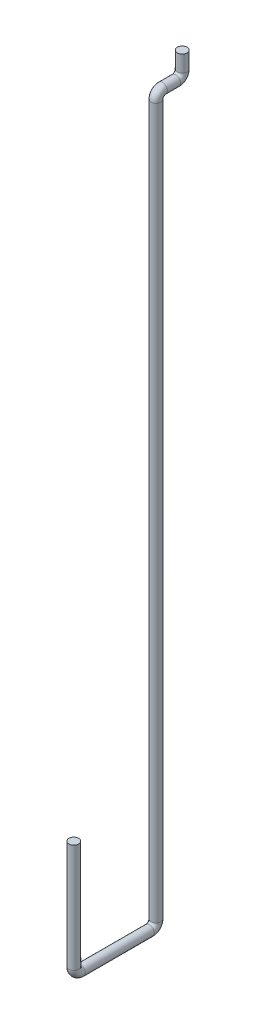
ISO-10303-21;
HEADER;
FILE_DESCRIPTION(('STEP AP214'),'2;1');
FILE_NAME('part.step','',(''),(''),'','','');
FILE_SCHEMA(('AUTOMOTIVE_DESIGN { 1 0 10303 214 1 1 1 1 }'));
ENDSEC;
DATA;
#1=APPLICATION_CONTEXT('core data for automotive mechanical design processes');
#2=APPLICATION_PROTOCOL_DEFINITION('international standard','automotive_design',2000,#1);
#3=PRODUCT_CONTEXT('',#1,'mechanical');
#4=PRODUCT('Part','Part','',(#3));
#5=PRODUCT_RELATED_PRODUCT_CATEGORY('part','',(#4));
#6=PRODUCT_DEFINITION_FORMATION('','',#4);
#7=PRODUCT_DEFINITION_CONTEXT('part definition',#1,'design');
#8=PRODUCT_DEFINITION('design','',#6,#7);
#9=PRODUCT_DEFINITION_SHAPE('','',#8);
#10=(LENGTH_UNIT() NAMED_UNIT(*) SI_UNIT(.MILLI.,.METRE.));
#11=(NAMED_UNIT(*) PLANE_ANGLE_UNIT() SI_UNIT($,.RADIAN.));
#12=(NAMED_UNIT(*) SI_UNIT($,.STERADIAN.) SOLID_ANGLE_UNIT());
#13=UNCERTAINTY_MEASURE_WITH_UNIT(LENGTH_MEASURE(1.E-05),#10,'distance_accuracy_value','');
#14=(GEOMETRIC_REPRESENTATION_CONTEXT(3) GLOBAL_UNCERTAINTY_ASSIGNED_CONTEXT((#13)) GLOBAL_UNIT_ASSIGNED_CONTEXT((#10,
#11,#12)) REPRESENTATION_CONTEXT('',''));
#15=CARTESIAN_POINT('',(0.,0.,0.));
#16=DIRECTION('',(0.,0.,1.));
#17=DIRECTION('',(1.,0.,0.));
#18=AXIS2_PLACEMENT_3D('',#15,#16,#17);
#19=CARTESIAN_POINT('',(0.,0.,0.));
#20=DIRECTION('',(0.,1.,0.));
#21=DIRECTION('',(0.,0.,1.));
#22=AXIS2_PLACEMENT_3D('',#19,#20,#21);
#23=PLANE('',#22);
#24=CARTESIAN_POINT('',(0.,0.,0.));
#25=DIRECTION('',(0.,1.,0.));
#26=DIRECTION('',(0.,0.,1.));
#27=AXIS2_PLACEMENT_3D('',#24,#25,#26);
#28=CIRCLE('',#27,1.5);
#29=CARTESIAN_POINT('',(0.,0.,1.5));
#30=VERTEX_POINT('',#29);
#31=EDGE_CURVE('E65',#30,#30,#28,.T.);
#32=ORIENTED_EDGE('',*,*,#31,.T.);
#33=EDGE_LOOP('',(#32));
#34=FACE_BOUND('',#33,.T.);
#35=ADVANCED_FACE('F31',(#34),#23,.T.);
#36=CARTESIAN_POINT('',(0.,-192.,32.9999999999999));
#37=DIRECTION('',(0.,-1.,0.));
#38=DIRECTION('',(0.,0.,-1.));
#39=AXIS2_PLACEMENT_3D('',#36,#37,#38);
#40=PLANE('',#39);
#41=CARTESIAN_POINT('',(0.,-192.,32.9999999999999));
#42=DIRECTION('',(0.,-1.,0.));
#43=DIRECTION('',(0.,0.,-1.));
#44=AXIS2_PLACEMENT_3D('',#41,#42,#43);
#45=CIRCLE('',#44,1.5);
#46=CARTESIAN_POINT('',(0.,-192.,31.4999999999999));
#47=VERTEX_POINT('',#46);
#48=EDGE_CURVE('E10',#47,#47,#45,.T.);
#49=ORIENTED_EDGE('',*,*,#48,.F.);
#50=EDGE_LOOP('',(#49));
#51=FACE_BOUND('',#50,.T.);
#52=ADVANCED_FACE('F73',(#51),#40,.F.);
#53=CARTESIAN_POINT('',(0.,0.,0.));
#54=DIRECTION('',(0.,-1.,0.));
#55=DIRECTION('',(0.,0.,-1.));
#56=AXIS2_PLACEMENT_3D('',#53,#54,#55);
#57=CYLINDRICAL_SURFACE('',#56,1.5);
#58=CARTESIAN_POINT('',(0.,-5.,0.));
#59=DIRECTION('',(0.,1.,0.));
#60=DIRECTION('',(0.,0.,1.));
#61=AXIS2_PLACEMENT_3D('',#58,#59,#60);
#62=CIRCLE('',#61,1.5);
#63=CARTESIAN_POINT('',(0.,-5.,-1.5));
#64=VERTEX_POINT('',#63);
#65=EDGE_CURVE('E62',#64,#64,#62,.T.);
#66=ORIENTED_EDGE('',*,*,#65,.T.);
#67=EDGE_LOOP('',(#66));
#68=FACE_BOUND('',#67,.T.);
#69=ORIENTED_EDGE('',*,*,#31,.F.);
#70=EDGE_LOOP('',(#69));
#71=FACE_BOUND('',#70,.T.);
#72=ADVANCED_FACE('F70',(#68,#71),#57,.T.);
#73=CARTESIAN_POINT('',(0.,-5.,2.));
#74=DIRECTION('',(-1.,0.,0.));
#75=DIRECTION('',(0.,0.,1.));
#76=AXIS2_PLACEMENT_3D('',#73,#74,#75);
#77=TOROIDAL_SURFACE('',#76,2.,1.5);
#78=CARTESIAN_POINT('',(0.,-7.,2.));
#79=DIRECTION('',(0.,0.,-1.));
#80=DIRECTION('',(0.,1.,0.));
#81=AXIS2_PLACEMENT_3D('',#78,#79,#80);
#82=CIRCLE('',#81,1.5);
#83=CARTESIAN_POINT('',(0.,-8.5,2.));
#84=VERTEX_POINT('',#83);
#85=EDGE_CURVE('E59',#84,#84,#82,.T.);
#86=CARTESIAN_POINT('',(0.,-5.,2.));
#87=DIRECTION('',(-1.,0.,0.));
#88=DIRECTION('',(0.,0.,1.));
#89=AXIS2_PLACEMENT_3D('',#86,#87,#88);
#90=CIRCLE('',#89,3.5);
#91=EDGE_CURVE('',#64,#84,#90,.T.);
#92=ORIENTED_EDGE('',*,*,#65,.F.);
#93=ORIENTED_EDGE('',*,*,#85,.T.);
#94=ORIENTED_EDGE('',*,*,#91,.T.);
#95=ORIENTED_EDGE('',*,*,#91,.F.);
#96=EDGE_LOOP('',(#92,#94,#93,#95));
#97=FACE_BOUND('',#96,.T.);
#98=ADVANCED_FACE('F72',(#97),#77,.T.);
#99=CARTESIAN_POINT('',(0.,-7.,2.));
#100=DIRECTION('',(0.,0.,1.));
#101=DIRECTION('',(0.,-1.,0.));
#102=AXIS2_PLACEMENT_3D('',#99,#100,#101);
#103=CYLINDRICAL_SURFACE('',#102,1.5);
#104=CARTESIAN_POINT('',(0.,-7.,6.));
#105=DIRECTION('',(0.,0.,-1.));
#106=DIRECTION('',(0.,1.,0.));
#107=AXIS2_PLACEMENT_3D('',#104,#105,#106);
#108=CIRCLE('',#107,1.5);
#109=CARTESIAN_POINT('',(0.,-5.5,6.));
#110=VERTEX_POINT('',#109);
#111=EDGE_CURVE('E56',#110,#110,#108,.T.);
#112=ORIENTED_EDGE('',*,*,#111,.T.);
#113=EDGE_LOOP('',(#112));
#114=FACE_BOUND('',#113,.T.);
#115=ORIENTED_EDGE('',*,*,#85,.F.);
#116=EDGE_LOOP('',(#115));
#117=FACE_BOUND('',#116,.T.);
#118=ADVANCED_FACE('F80',(#114,#117),#103,.T.);
#119=CARTESIAN_POINT('',(0.,-9.,6.));
#120=DIRECTION('',(1.,0.,0.));
#121=DIRECTION('',(0.,0.,-1.));
#122=AXIS2_PLACEMENT_3D('',#119,#120,#121);
#123=TOROIDAL_SURFACE('',#122,2.,1.5);
#124=CARTESIAN_POINT('',(0.,-9.,8.));
#125=DIRECTION('',(0.,1.,0.));
#126=DIRECTION('',(0.,0.,1.));
#127=AXIS2_PLACEMENT_3D('',#124,#125,#126);
#128=CIRCLE('',#127,1.5);
#129=CARTESIAN_POINT('',(0.,-9.,9.5));
#130=VERTEX_POINT('',#129);
#131=EDGE_CURVE('E53',#130,#130,#128,.T.);
#132=CARTESIAN_POINT('',(0.,-9.,6.));
#133=DIRECTION('',(1.,0.,0.));
#134=DIRECTION('',(0.,0.,-1.));
#135=AXIS2_PLACEMENT_3D('',#132,#133,#134);
#136=CIRCLE('',#135,3.5);
#137=EDGE_CURVE('',#110,#130,#136,.T.);
#138=ORIENTED_EDGE('',*,*,#111,.F.);
#139=ORIENTED_EDGE('',*,*,#131,.T.);
#140=ORIENTED_EDGE('',*,*,#137,.T.);
#141=ORIENTED_EDGE('',*,*,#137,.F.);
#142=EDGE_LOOP('',(#138,#140,#139,#141));
#143=FACE_BOUND('',#142,.T.);
#144=ADVANCED_FACE('F105',(#143),#123,.T.);
#145=CARTESIAN_POINT('',(0.,-9.,8.));
#146=DIRECTION('',(0.,-1.,0.));
#147=DIRECTION('',(0.,0.,-1.));
#148=AXIS2_PLACEMENT_3D('',#145,#146,#147);
#149=CYLINDRICAL_SURFACE('',#148,1.5);
#150=CARTESIAN_POINT('',(0.,-225.,7.99999999999997));
#151=DIRECTION('',(0.,1.,0.));
#152=DIRECTION('',(0.,0.,1.));
#153=AXIS2_PLACEMENT_3D('',#150,#151,#152);
#154=CIRCLE('',#153,1.5);
#155=CARTESIAN_POINT('',(0.,-225.,6.49999999999997));
#156=VERTEX_POINT('',#155);
#157=EDGE_CURVE('E50',#156,#156,#154,.T.);
#158=ORIENTED_EDGE('',*,*,#157,.T.);
#159=EDGE_LOOP('',(#158));
#160=FACE_BOUND('',#159,.T.);
#161=ORIENTED_EDGE('',*,*,#131,.F.);
#162=EDGE_LOOP('',(#161));
#163=FACE_BOUND('',#162,.T.);
#164=ADVANCED_FACE('F101',(#160,#163),#149,.T.);
#165=CARTESIAN_POINT('',(0.,-225.,9.99999999999997));
#166=DIRECTION('',(-1.,0.,0.));
#167=DIRECTION('',(0.,0.,1.));
#168=AXIS2_PLACEMENT_3D('',#165,#166,#167);
#169=TOROIDAL_SURFACE('',#168,2.,1.5);
#170=CARTESIAN_POINT('',(0.,-227.,9.99999999999997));
#171=DIRECTION('',(0.,0.,-1.));
#172=DIRECTION('',(0.,1.,0.));
#173=AXIS2_PLACEMENT_3D('',#170,#171,#172);
#174=CIRCLE('',#173,1.5);
#175=CARTESIAN_POINT('',(0.,-228.5,9.99999999999997));
#176=VERTEX_POINT('',#175);
#177=EDGE_CURVE('E45',#176,#176,#174,.T.);
#178=CARTESIAN_POINT('',(0.,-225.,9.99999999999997));
#179=DIRECTION('',(-1.,0.,0.));
#180=DIRECTION('',(0.,0.,1.));
#181=AXIS2_PLACEMENT_3D('',#178,#179,#180);
#182=CIRCLE('',#181,3.5);
#183=EDGE_CURVE('',#156,#176,#182,.T.);
#184=ORIENTED_EDGE('',*,*,#157,.F.);
#185=ORIENTED_EDGE('',*,*,#177,.T.);
#186=ORIENTED_EDGE('',*,*,#183,.T.);
#187=ORIENTED_EDGE('',*,*,#183,.F.);
#188=EDGE_LOOP('',(#184,#186,#185,#187));
#189=FACE_BOUND('',#188,.T.);
#190=ADVANCED_FACE('F97',(#189),#169,.T.);
#191=CARTESIAN_POINT('',(0.,-227.,9.99999999999997));
#192=DIRECTION('',(0.,0.,1.));
#193=DIRECTION('',(0.,-1.,0.));
#194=AXIS2_PLACEMENT_3D('',#191,#192,#193);
#195=CYLINDRICAL_SURFACE('',#194,1.5);
#196=CARTESIAN_POINT('',(0.,-227.,31.));
#197=DIRECTION('',(0.,0.,-1.));
#198=DIRECTION('',(0.,1.,0.));
#199=AXIS2_PLACEMENT_3D('',#196,#197,#198);
#200=CIRCLE('',#199,1.5);
#201=CARTESIAN_POINT('',(0.,-228.5,31.));
#202=VERTEX_POINT('',#201);
#203=EDGE_CURVE('E41',#202,#202,#200,.T.);
#204=ORIENTED_EDGE('',*,*,#203,.T.);
#205=EDGE_LOOP('',(#204));
#206=FACE_BOUND('',#205,.T.);
#207=ORIENTED_EDGE('',*,*,#177,.F.);
#208=EDGE_LOOP('',(#207));
#209=FACE_BOUND('',#208,.T.);
#210=ADVANCED_FACE('F91',(#206,#209),#195,.T.);
#211=CARTESIAN_POINT('',(0.,-225.,31.));
#212=DIRECTION('',(-1.,0.,0.));
#213=DIRECTION('',(0.,0.,1.));
#214=AXIS2_PLACEMENT_3D('',#211,#212,#213);
#215=TOROIDAL_SURFACE('',#214,2.00000000000003,1.5);
#216=CARTESIAN_POINT('',(0.,-225.,33.));
#217=DIRECTION('',(0.,-1.,0.));
#218=DIRECTION('',(0.,0.,-1.));
#219=AXIS2_PLACEMENT_3D('',#216,#217,#218);
#220=CIRCLE('',#219,1.5);
#221=CARTESIAN_POINT('',(0.,-225.,34.5));
#222=VERTEX_POINT('',#221);
#223=EDGE_CURVE('E37',#222,#222,#220,.T.);
#224=CARTESIAN_POINT('',(0.,-225.,31.));
#225=DIRECTION('',(-1.,0.,0.));
#226=DIRECTION('',(0.,0.,1.));
#227=AXIS2_PLACEMENT_3D('',#224,#225,#226);
#228=CIRCLE('',#227,3.50000000000003);
#229=EDGE_CURVE('',#202,#222,#228,.T.);
#230=ORIENTED_EDGE('',*,*,#203,.F.);
#231=ORIENTED_EDGE('',*,*,#223,.T.);
#232=ORIENTED_EDGE('',*,*,#229,.T.);
#233=ORIENTED_EDGE('',*,*,#229,.F.);
#234=EDGE_LOOP('',(#230,#232,#231,#233));
#235=FACE_BOUND('',#234,.T.);
#236=ADVANCED_FACE('F86',(#235),#215,.T.);
#237=CARTESIAN_POINT('',(0.,-225.,33.));
#238=DIRECTION('',(0.,1.,0.));
#239=DIRECTION('',(0.,0.,1.));
#240=AXIS2_PLACEMENT_3D('',#237,#238,#239);
#241=CYLINDRICAL_SURFACE('',#240,1.5);
#242=ORIENTED_EDGE('',*,*,#48,.T.);
#243=EDGE_LOOP('',(#242));
#244=FACE_BOUND('',#243,.T.);
#245=ORIENTED_EDGE('',*,*,#223,.F.);
#246=EDGE_LOOP('',(#245));
#247=FACE_BOUND('',#246,.T.);
#248=ADVANCED_FACE('F84',(#244,#247),#241,.T.);
#249=CLOSED_SHELL('',(#35,#52,#72,#98,#118,#144,#164,#190,#210,#236,#248));
#250=MANIFOLD_SOLID_BREP('B2',#249);
#251=ADVANCED_BREP_SHAPE_REPRESENTATION('',(#18,#250),#14);
#252=SHAPE_DEFINITION_REPRESENTATION(#9,#251);
ENDSEC;
END-ISO-10303-21;
